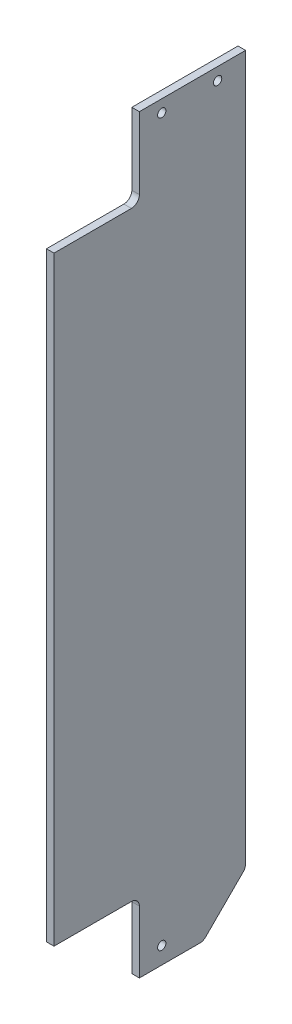
ISO-10303-21;
HEADER;
FILE_DESCRIPTION(('STEP AP214'),'2;1');
FILE_NAME('part.step','',(''),(''),'','','');
FILE_SCHEMA(('AUTOMOTIVE_DESIGN { 1 0 10303 214 1 1 1 1 }'));
ENDSEC;
DATA;
#1=APPLICATION_CONTEXT('core data for automotive mechanical design processes');
#2=APPLICATION_PROTOCOL_DEFINITION('international standard','automotive_design',2000,#1);
#3=PRODUCT_CONTEXT('',#1,'mechanical');
#4=PRODUCT('Part','Part','',(#3));
#5=PRODUCT_RELATED_PRODUCT_CATEGORY('part','',(#4));
#6=PRODUCT_DEFINITION_FORMATION('','',#4);
#7=PRODUCT_DEFINITION_CONTEXT('part definition',#1,'design');
#8=PRODUCT_DEFINITION('design','',#6,#7);
#9=PRODUCT_DEFINITION_SHAPE('','',#8);
#10=(LENGTH_UNIT() NAMED_UNIT(*) SI_UNIT(.MILLI.,.METRE.));
#11=(NAMED_UNIT(*) PLANE_ANGLE_UNIT() SI_UNIT($,.RADIAN.));
#12=(NAMED_UNIT(*) SI_UNIT($,.STERADIAN.) SOLID_ANGLE_UNIT());
#13=UNCERTAINTY_MEASURE_WITH_UNIT(LENGTH_MEASURE(1.E-05),#10,'distance_accuracy_value','');
#14=(GEOMETRIC_REPRESENTATION_CONTEXT(3) GLOBAL_UNCERTAINTY_ASSIGNED_CONTEXT((#13)) GLOBAL_UNIT_ASSIGNED_CONTEXT((#10,
#11,#12)) REPRESENTATION_CONTEXT('',''));
#15=CARTESIAN_POINT('',(0.,0.,0.));
#16=DIRECTION('',(0.,0.,1.));
#17=DIRECTION('',(1.,0.,0.));
#18=AXIS2_PLACEMENT_3D('',#15,#16,#17);
#19=CARTESIAN_POINT('',(3.,0.,0.));
#20=DIRECTION('',(-1.,0.,0.));
#21=DIRECTION('',(0.,0.,1.));
#22=AXIS2_PLACEMENT_3D('',#19,#20,#21);
#23=PLANE('',#22);
#24=DIRECTION('',(0.,0.707106781186547,-0.707106781186548));
#25=VECTOR('',#24,1.);
#26=CARTESIAN_POINT('',(3.,-249.8725,-60.3250000000001));
#27=LINE('',#26,#25);
#28=CARTESIAN_POINT('',(3.,-265.770064030267,-44.4274359697327));
#29=VERTEX_POINT('',#28);
#30=CARTESIAN_POINT('',(3.,-250.802435969733,-59.3950640302674));
#31=VERTEX_POINT('',#30);
#32=EDGE_CURVE('E245',#29,#31,#27,.T.);
#33=ORIENTED_EDGE('',*,*,#32,.T.);
#34=CARTESIAN_POINT('',(3.,-248.557371939465,-57.1500000000001));
#35=DIRECTION('',(-1.,0.,0.));
#36=DIRECTION('',(0.,0.,1.));
#37=AXIS2_PLACEMENT_3D('',#34,#35,#36);
#38=CIRCLE('',#37,3.175);
#39=CARTESIAN_POINT('',(3.,-248.557371939465,-60.3250000000001));
#40=VERTEX_POINT('',#39);
#41=EDGE_CURVE('E200',#31,#40,#38,.F.);
#42=ORIENTED_EDGE('',*,*,#41,.T.);
#43=DIRECTION('',(0.,1.,0.));
#44=VECTOR('',#43,1.);
#45=CARTESIAN_POINT('',(3.,31.75,-60.325));
#46=LINE('',#45,#44);
#47=CARTESIAN_POINT('',(3.,31.75,-60.325));
#48=VERTEX_POINT('',#47);
#49=EDGE_CURVE('E250',#40,#48,#46,.T.);
#50=ORIENTED_EDGE('',*,*,#49,.T.);
#51=DIRECTION('',(0.,0.,1.));
#52=VECTOR('',#51,1.);
#53=CARTESIAN_POINT('',(3.,31.75,-18.0975));
#54=LINE('',#53,#52);
#55=CARTESIAN_POINT('',(3.,31.75,-18.0975));
#56=VERTEX_POINT('',#55);
#57=EDGE_CURVE('E253',#48,#56,#54,.T.);
#58=ORIENTED_EDGE('',*,*,#57,.T.);
#59=DIRECTION('',(0.,-1.,0.));
#60=VECTOR('',#59,1.);
#61=CARTESIAN_POINT('',(3.,0.,-18.0975));
#62=LINE('',#61,#60);
#63=CARTESIAN_POINT('',(3.,3.175,-18.0975));
#64=VERTEX_POINT('',#63);
#65=EDGE_CURVE('E256',#56,#64,#62,.T.);
#66=ORIENTED_EDGE('',*,*,#65,.T.);
#67=CARTESIAN_POINT('',(3.,3.175,-14.9225));
#68=DIRECTION('',(-1.,0.,0.));
#69=DIRECTION('',(0.,0.,1.));
#70=AXIS2_PLACEMENT_3D('',#67,#68,#69);
#71=CIRCLE('',#70,3.175);
#72=CARTESIAN_POINT('',(3.,0.,-14.9225));
#73=VERTEX_POINT('',#72);
#74=EDGE_CURVE('E63',#64,#73,#71,.T.);
#75=ORIENTED_EDGE('',*,*,#74,.T.);
#76=DIRECTION('',(0.,0.,1.));
#77=VECTOR('',#76,1.);
#78=CARTESIAN_POINT('',(3.,0.,15.875));
#79=LINE('',#78,#77);
#80=CARTESIAN_POINT('',(3.,0.,15.875));
#81=VERTEX_POINT('',#80);
#82=EDGE_CURVE('E161',#73,#81,#79,.T.);
#83=ORIENTED_EDGE('',*,*,#82,.T.);
#84=DIRECTION('',(0.,-1.,0.));
#85=VECTOR('',#84,1.);
#86=CARTESIAN_POINT('',(3.,-238.76,15.875));
#87=LINE('',#86,#85);
#88=CARTESIAN_POINT('',(3.,-238.76,15.875));
#89=VERTEX_POINT('',#88);
#90=EDGE_CURVE('E156',#81,#89,#87,.T.);
#91=ORIENTED_EDGE('',*,*,#90,.T.);
#92=DIRECTION('',(0.,0.,-1.));
#93=VECTOR('',#92,1.);
#94=CARTESIAN_POINT('',(3.,-238.76,-18.0975));
#95=LINE('',#94,#93);
#96=CARTESIAN_POINT('',(3.,-238.76,-14.9225));
#97=VERTEX_POINT('',#96);
#98=EDGE_CURVE('E144',#89,#97,#95,.T.);
#99=ORIENTED_EDGE('',*,*,#98,.T.);
#100=CARTESIAN_POINT('',(3.,-241.935,-14.9225));
#101=DIRECTION('',(-1.,0.,0.));
#102=DIRECTION('',(0.,0.,1.));
#103=AXIS2_PLACEMENT_3D('',#100,#101,#102);
#104=CIRCLE('',#103,3.175);
#105=CARTESIAN_POINT('',(3.,-241.935,-18.0975));
#106=VERTEX_POINT('',#105);
#107=EDGE_CURVE('E11',#97,#106,#104,.T.);
#108=ORIENTED_EDGE('',*,*,#107,.T.);
#109=DIRECTION('',(0.,-1.,0.));
#110=VECTOR('',#109,1.);
#111=CARTESIAN_POINT('',(3.,-266.7,-18.0975));
#112=LINE('',#111,#110);
#113=CARTESIAN_POINT('',(3.,-266.7,-18.0975));
#114=VERTEX_POINT('',#113);
#115=EDGE_CURVE('E155',#106,#114,#112,.T.);
#116=ORIENTED_EDGE('',*,*,#115,.T.);
#117=DIRECTION('',(0.,0.,-1.));
#118=VECTOR('',#117,1.);
#119=CARTESIAN_POINT('',(3.,-266.7,-43.4975));
#120=LINE('',#119,#118);
#121=CARTESIAN_POINT('',(3.,-266.7,-42.1823719394654));
#122=VERTEX_POINT('',#121);
#123=EDGE_CURVE('E242',#114,#122,#120,.T.);
#124=ORIENTED_EDGE('',*,*,#123,.T.);
#125=CARTESIAN_POINT('',(3.,-263.525,-42.1823719394654));
#126=DIRECTION('',(-1.,0.,0.));
#127=DIRECTION('',(0.,0.,1.));
#128=AXIS2_PLACEMENT_3D('',#125,#126,#127);
#129=CIRCLE('',#128,3.175);
#130=EDGE_CURVE('E197',#122,#29,#129,.F.);
#131=ORIENTED_EDGE('',*,*,#130,.T.);
#132=EDGE_LOOP('',(#33,#42,#50,#58,#66,#75,#83,#91,#99,#108,#116,#124,#131));
#133=FACE_BOUND('',#132,.T.);
#134=CARTESIAN_POINT('',(3.,26.8732,-49.2125));
#135=DIRECTION('',(1.,0.,0.));
#136=DIRECTION('',(0.,0.,-1.));
#137=AXIS2_PLACEMENT_3D('',#134,#135,#136);
#138=CIRCLE('',#137,1.65);
#139=CARTESIAN_POINT('',(3.,26.8732,-50.8625));
#140=VERTEX_POINT('',#139);
#141=EDGE_CURVE('E263',#140,#140,#138,.T.);
#142=ORIENTED_EDGE('',*,*,#141,.F.);
#143=EDGE_LOOP('',(#142));
#144=FACE_BOUND('',#143,.T.);
#145=CARTESIAN_POINT('',(3.,26.8732,-26.9875));
#146=DIRECTION('',(1.,0.,0.));
#147=DIRECTION('',(0.,0.,-1.));
#148=AXIS2_PLACEMENT_3D('',#145,#146,#147);
#149=CIRCLE('',#148,1.65);
#150=CARTESIAN_POINT('',(3.,26.8732,-28.6375));
#151=VERTEX_POINT('',#150);
#152=EDGE_CURVE('E355',#151,#151,#149,.T.);
#153=ORIENTED_EDGE('',*,*,#152,.F.);
#154=EDGE_LOOP('',(#153));
#155=FACE_BOUND('',#154,.T.);
#156=CARTESIAN_POINT('',(3.,-259.9563,-26.9875));
#157=DIRECTION('',(1.,0.,0.));
#158=DIRECTION('',(0.,0.,1.));
#159=AXIS2_PLACEMENT_3D('',#156,#157,#158);
#160=CIRCLE('',#159,1.65000000000004);
#161=CARTESIAN_POINT('',(3.,-259.9563,-25.3375));
#162=VERTEX_POINT('',#161);
#163=EDGE_CURVE('E344',#162,#162,#160,.T.);
#164=ORIENTED_EDGE('',*,*,#163,.F.);
#165=EDGE_LOOP('',(#164));
#166=FACE_BOUND('',#165,.T.);
#167=ADVANCED_FACE('F47',(#133,#144,#155,#166),#23,.F.);
#168=CARTESIAN_POINT('',(0.,0.,0.));
#169=DIRECTION('',(-1.,0.,0.));
#170=DIRECTION('',(0.,0.,1.));
#171=AXIS2_PLACEMENT_3D('',#168,#169,#170);
#172=PLANE('',#171);
#173=CARTESIAN_POINT('',(0.,26.8732,-26.9875));
#174=DIRECTION('',(1.,0.,0.));
#175=DIRECTION('',(0.,0.,-1.));
#176=AXIS2_PLACEMENT_3D('',#173,#174,#175);
#177=CIRCLE('',#176,1.65);
#178=CARTESIAN_POINT('',(0.,26.8732,-28.6375));
#179=VERTEX_POINT('',#178);
#180=EDGE_CURVE('E352',#179,#179,#177,.T.);
#181=ORIENTED_EDGE('',*,*,#180,.T.);
#182=EDGE_LOOP('',(#181));
#183=FACE_BOUND('',#182,.T.);
#184=DIRECTION('',(0.,1.,0.));
#185=VECTOR('',#184,1.);
#186=CARTESIAN_POINT('',(0.,31.75,-60.325));
#187=LINE('',#186,#185);
#188=CARTESIAN_POINT('',(0.,-248.557371939465,-60.3250000000001));
#189=VERTEX_POINT('',#188);
#190=CARTESIAN_POINT('',(0.,31.75,-60.325));
#191=VERTEX_POINT('',#190);
#192=EDGE_CURVE('E275',#189,#191,#187,.T.);
#193=ORIENTED_EDGE('',*,*,#192,.F.);
#194=CARTESIAN_POINT('',(0.,-248.557371939465,-57.1500000000001));
#195=DIRECTION('',(-1.,0.,0.));
#196=DIRECTION('',(0.,0.,1.));
#197=AXIS2_PLACEMENT_3D('',#194,#195,#196);
#198=CIRCLE('',#197,3.175);
#199=CARTESIAN_POINT('',(0.,-250.802435969733,-59.3950640302674));
#200=VERTEX_POINT('',#199);
#201=EDGE_CURVE('E187',#189,#200,#198,.T.);
#202=ORIENTED_EDGE('',*,*,#201,.T.);
#203=DIRECTION('',(0.,0.707106781186547,-0.707106781186548));
#204=VECTOR('',#203,1.);
#205=CARTESIAN_POINT('',(0.,-249.8725,-60.3250000000001));
#206=LINE('',#205,#204);
#207=CARTESIAN_POINT('',(0.,-265.770064030267,-44.4274359697327));
#208=VERTEX_POINT('',#207);
#209=EDGE_CURVE('E271',#208,#200,#206,.T.);
#210=ORIENTED_EDGE('',*,*,#209,.F.);
#211=CARTESIAN_POINT('',(0.,-263.525,-42.1823719394654));
#212=DIRECTION('',(-1.,0.,0.));
#213=DIRECTION('',(0.,0.,1.));
#214=AXIS2_PLACEMENT_3D('',#211,#212,#213);
#215=CIRCLE('',#214,3.175);
#216=CARTESIAN_POINT('',(0.,-266.7,-42.1823719394654));
#217=VERTEX_POINT('',#216);
#218=EDGE_CURVE('E178',#208,#217,#215,.T.);
#219=ORIENTED_EDGE('',*,*,#218,.T.);
#220=DIRECTION('',(0.,0.,-1.));
#221=VECTOR('',#220,1.);
#222=CARTESIAN_POINT('',(0.,-266.7,-43.4975));
#223=LINE('',#222,#221);
#224=CARTESIAN_POINT('',(0.,-266.7,-18.0975));
#225=VERTEX_POINT('',#224);
#226=EDGE_CURVE('E267',#225,#217,#223,.T.);
#227=ORIENTED_EDGE('',*,*,#226,.F.);
#228=DIRECTION('',(0.,-1.,0.));
#229=VECTOR('',#228,1.);
#230=CARTESIAN_POINT('',(0.,-266.7,-18.0975));
#231=LINE('',#230,#229);
#232=CARTESIAN_POINT('',(0.,-241.935,-18.0975));
#233=VERTEX_POINT('',#232);
#234=EDGE_CURVE('E230',#233,#225,#231,.T.);
#235=ORIENTED_EDGE('',*,*,#234,.F.);
#236=CARTESIAN_POINT('',(0.,-241.935,-14.9225));
#237=DIRECTION('',(-1.,0.,0.));
#238=DIRECTION('',(0.,0.,1.));
#239=AXIS2_PLACEMENT_3D('',#236,#237,#238);
#240=CIRCLE('',#239,3.175);
#241=CARTESIAN_POINT('',(0.,-238.76,-14.9225));
#242=VERTEX_POINT('',#241);
#243=EDGE_CURVE('E56',#233,#242,#240,.F.);
#244=ORIENTED_EDGE('',*,*,#243,.T.);
#245=DIRECTION('',(0.,0.,-1.));
#246=VECTOR('',#245,1.);
#247=CARTESIAN_POINT('',(0.,-238.76,-18.0975));
#248=LINE('',#247,#246);
#249=CARTESIAN_POINT('',(0.,-238.76,15.875));
#250=VERTEX_POINT('',#249);
#251=EDGE_CURVE('E228',#250,#242,#248,.T.);
#252=ORIENTED_EDGE('',*,*,#251,.F.);
#253=DIRECTION('',(0.,-1.,0.));
#254=VECTOR('',#253,1.);
#255=CARTESIAN_POINT('',(0.,-238.76,15.875));
#256=LINE('',#255,#254);
#257=CARTESIAN_POINT('',(0.,0.,15.875));
#258=VERTEX_POINT('',#257);
#259=EDGE_CURVE('E170',#258,#250,#256,.T.);
#260=ORIENTED_EDGE('',*,*,#259,.F.);
#261=DIRECTION('',(0.,0.,1.));
#262=VECTOR('',#261,1.);
#263=CARTESIAN_POINT('',(0.,0.,15.875));
#264=LINE('',#263,#262);
#265=CARTESIAN_POINT('',(0.,0.,-14.9225));
#266=VERTEX_POINT('',#265);
#267=EDGE_CURVE('E166',#266,#258,#264,.T.);
#268=ORIENTED_EDGE('',*,*,#267,.F.);
#269=CARTESIAN_POINT('',(0.,3.175,-14.9225));
#270=DIRECTION('',(-1.,0.,0.));
#271=DIRECTION('',(0.,0.,1.));
#272=AXIS2_PLACEMENT_3D('',#269,#270,#271);
#273=CIRCLE('',#272,3.175);
#274=CARTESIAN_POINT('',(0.,3.175,-18.0975));
#275=VERTEX_POINT('',#274);
#276=EDGE_CURVE('E218',#266,#275,#273,.F.);
#277=ORIENTED_EDGE('',*,*,#276,.T.);
#278=DIRECTION('',(0.,-1.,0.));
#279=VECTOR('',#278,1.);
#280=CARTESIAN_POINT('',(0.,0.,-18.0975));
#281=LINE('',#280,#279);
#282=CARTESIAN_POINT('',(0.,31.75,-18.0975));
#283=VERTEX_POINT('',#282);
#284=EDGE_CURVE('E281',#283,#275,#281,.T.);
#285=ORIENTED_EDGE('',*,*,#284,.F.);
#286=DIRECTION('',(0.,0.,1.));
#287=VECTOR('',#286,1.);
#288=CARTESIAN_POINT('',(0.,31.75,-18.0975));
#289=LINE('',#288,#287);
#290=EDGE_CURVE('E278',#191,#283,#289,.T.);
#291=ORIENTED_EDGE('',*,*,#290,.F.);
#292=EDGE_LOOP('',(#193,#202,#210,#219,#227,#235,#244,#252,#260,#268,#277,#285,#291));
#293=FACE_BOUND('',#292,.T.);
#294=CARTESIAN_POINT('',(0.,26.8732,-49.2125));
#295=DIRECTION('',(1.,0.,0.));
#296=DIRECTION('',(0.,0.,-1.));
#297=AXIS2_PLACEMENT_3D('',#294,#295,#296);
#298=CIRCLE('',#297,1.65);
#299=CARTESIAN_POINT('',(0.,26.8732,-50.8625));
#300=VERTEX_POINT('',#299);
#301=EDGE_CURVE('E359',#300,#300,#298,.T.);
#302=ORIENTED_EDGE('',*,*,#301,.T.);
#303=EDGE_LOOP('',(#302));
#304=FACE_BOUND('',#303,.T.);
#305=CARTESIAN_POINT('',(0.,-259.9563,-26.9875));
#306=DIRECTION('',(1.,0.,0.));
#307=DIRECTION('',(0.,0.,1.));
#308=AXIS2_PLACEMENT_3D('',#305,#306,#307);
#309=CIRCLE('',#308,1.65000000000004);
#310=CARTESIAN_POINT('',(0.,-259.9563,-25.3375));
#311=VERTEX_POINT('',#310);
#312=EDGE_CURVE('E347',#311,#311,#309,.T.);
#313=ORIENTED_EDGE('',*,*,#312,.T.);
#314=EDGE_LOOP('',(#313));
#315=FACE_BOUND('',#314,.T.);
#316=ADVANCED_FACE('F226',(#183,#293,#304,#315),#172,.T.);
#317=CARTESIAN_POINT('',(3.,-238.76,15.875));
#318=DIRECTION('',(0.,0.,-1.));
#319=DIRECTION('',(0.,1.,0.));
#320=AXIS2_PLACEMENT_3D('',#317,#318,#319);
#321=PLANE('',#320);
#322=ORIENTED_EDGE('',*,*,#259,.T.);
#323=DIRECTION('',(-1.,0.,0.));
#324=VECTOR('',#323,1.);
#325=CARTESIAN_POINT('',(3.,-238.76,15.875));
#326=LINE('',#325,#324);
#327=EDGE_CURVE('E149',#89,#250,#326,.T.);
#328=ORIENTED_EDGE('',*,*,#327,.F.);
#329=ORIENTED_EDGE('',*,*,#90,.F.);
#330=DIRECTION('',(-1.,0.,0.));
#331=VECTOR('',#330,1.);
#332=CARTESIAN_POINT('',(3.,0.,15.875));
#333=LINE('',#332,#331);
#334=EDGE_CURVE('E261',#81,#258,#333,.T.);
#335=ORIENTED_EDGE('',*,*,#334,.T.);
#336=EDGE_LOOP('',(#322,#328,#329,#335));
#337=FACE_BOUND('',#336,.T.);
#338=ADVANCED_FACE('F168',(#337),#321,.F.);
#339=CARTESIAN_POINT('',(3.,-238.76,-18.0975));
#340=DIRECTION('',(0.,1.,0.));
#341=DIRECTION('',(0.,0.,1.));
#342=AXIS2_PLACEMENT_3D('',#339,#340,#341);
#343=PLANE('',#342);
#344=ORIENTED_EDGE('',*,*,#251,.T.);
#345=DIRECTION('',(-1.,0.,0.));
#346=VECTOR('',#345,1.);
#347=CARTESIAN_POINT('',(3.,-238.76,-14.9225));
#348=LINE('',#347,#346);
#349=EDGE_CURVE('E152',#242,#97,#348,.F.);
#350=ORIENTED_EDGE('',*,*,#349,.T.);
#351=ORIENTED_EDGE('',*,*,#98,.F.);
#352=ORIENTED_EDGE('',*,*,#327,.T.);
#353=EDGE_LOOP('',(#344,#350,#351,#352));
#354=FACE_BOUND('',#353,.T.);
#355=ADVANCED_FACE('F147',(#354),#343,.F.);
#356=CARTESIAN_POINT('',(3.,-266.7,-18.0975));
#357=DIRECTION('',(0.,0.,-1.));
#358=DIRECTION('',(-1.,0.,0.));
#359=AXIS2_PLACEMENT_3D('',#356,#357,#358);
#360=PLANE('',#359);
#361=ORIENTED_EDGE('',*,*,#115,.F.);
#362=DIRECTION('',(-1.,0.,0.));
#363=VECTOR('',#362,1.);
#364=CARTESIAN_POINT('',(0.,-241.935,-18.0975));
#365=LINE('',#364,#363);
#366=EDGE_CURVE('E212',#106,#233,#365,.T.);
#367=ORIENTED_EDGE('',*,*,#366,.T.);
#368=ORIENTED_EDGE('',*,*,#234,.T.);
#369=DIRECTION('',(-1.,0.,0.));
#370=VECTOR('',#369,1.);
#371=CARTESIAN_POINT('',(3.,-266.7,-18.0975));
#372=LINE('',#371,#370);
#373=EDGE_CURVE('E173',#114,#225,#372,.T.);
#374=ORIENTED_EDGE('',*,*,#373,.F.);
#375=EDGE_LOOP('',(#361,#367,#368,#374));
#376=FACE_BOUND('',#375,.T.);
#377=ADVANCED_FACE('F239',(#376),#360,.F.);
#378=CARTESIAN_POINT('',(3.,-266.7,-43.4975));
#379=DIRECTION('',(0.,1.,0.));
#380=DIRECTION('',(0.,0.,1.));
#381=AXIS2_PLACEMENT_3D('',#378,#379,#380);
#382=PLANE('',#381);
#383=ORIENTED_EDGE('',*,*,#226,.T.);
#384=DIRECTION('',(-1.,0.,0.));
#385=VECTOR('',#384,1.);
#386=CARTESIAN_POINT('',(3.,-266.7,-42.1823719394654));
#387=LINE('',#386,#385);
#388=EDGE_CURVE('E203',#217,#122,#387,.F.);
#389=ORIENTED_EDGE('',*,*,#388,.T.);
#390=ORIENTED_EDGE('',*,*,#123,.F.);
#391=ORIENTED_EDGE('',*,*,#373,.T.);
#392=EDGE_LOOP('',(#383,#389,#390,#391));
#393=FACE_BOUND('',#392,.T.);
#394=ADVANCED_FACE('F459',(#393),#382,.F.);
#395=CARTESIAN_POINT('',(3.,-249.8725,-60.3250000000001));
#396=DIRECTION('',(0.,0.707106781186548,0.707106781186547));
#397=DIRECTION('',(0.,-0.707106781186547,0.707106781186548));
#398=AXIS2_PLACEMENT_3D('',#395,#396,#397);
#399=PLANE('',#398);
#400=ORIENTED_EDGE('',*,*,#209,.T.);
#401=DIRECTION('',(-1.,0.,0.));
#402=VECTOR('',#401,1.);
#403=CARTESIAN_POINT('',(3.,-250.802435969733,-59.3950640302674));
#404=LINE('',#403,#402);
#405=EDGE_CURVE('E194',#200,#31,#404,.F.);
#406=ORIENTED_EDGE('',*,*,#405,.T.);
#407=ORIENTED_EDGE('',*,*,#32,.F.);
#408=DIRECTION('',(-1.,0.,0.));
#409=VECTOR('',#408,1.);
#410=CARTESIAN_POINT('',(3.,-265.770064030267,-44.4274359697327));
#411=LINE('',#410,#409);
#412=EDGE_CURVE('E190',#29,#208,#411,.T.);
#413=ORIENTED_EDGE('',*,*,#412,.T.);
#414=EDGE_LOOP('',(#400,#406,#407,#413));
#415=FACE_BOUND('',#414,.T.);
#416=ADVANCED_FACE('F450',(#415),#399,.F.);
#417=CARTESIAN_POINT('',(3.,31.75,-60.325));
#418=DIRECTION('',(0.,0.,1.));
#419=DIRECTION('',(0.,-1.,0.));
#420=AXIS2_PLACEMENT_3D('',#417,#418,#419);
#421=PLANE('',#420);
#422=ORIENTED_EDGE('',*,*,#49,.F.);
#423=DIRECTION('',(-1.,0.,0.));
#424=VECTOR('',#423,1.);
#425=CARTESIAN_POINT('',(3.,-248.557371939465,-60.3250000000001));
#426=LINE('',#425,#424);
#427=EDGE_CURVE('E172',#40,#189,#426,.T.);
#428=ORIENTED_EDGE('',*,*,#427,.T.);
#429=ORIENTED_EDGE('',*,*,#192,.T.);
#430=DIRECTION('',(-1.,0.,0.));
#431=VECTOR('',#430,1.);
#432=CARTESIAN_POINT('',(3.,31.75,-60.325));
#433=LINE('',#432,#431);
#434=EDGE_CURVE('E181',#48,#191,#433,.T.);
#435=ORIENTED_EDGE('',*,*,#434,.F.);
#436=EDGE_LOOP('',(#422,#428,#429,#435));
#437=FACE_BOUND('',#436,.T.);
#438=ADVANCED_FACE('F441',(#437),#421,.F.);
#439=CARTESIAN_POINT('',(3.,31.75,-18.0975));
#440=DIRECTION('',(0.,-1.,0.));
#441=DIRECTION('',(0.,0.,-1.));
#442=AXIS2_PLACEMENT_3D('',#439,#440,#441);
#443=PLANE('',#442);
#444=ORIENTED_EDGE('',*,*,#290,.T.);
#445=DIRECTION('',(-1.,0.,0.));
#446=VECTOR('',#445,1.);
#447=CARTESIAN_POINT('',(3.,31.75,-18.0975));
#448=LINE('',#447,#446);
#449=EDGE_CURVE('E288',#56,#283,#448,.T.);
#450=ORIENTED_EDGE('',*,*,#449,.F.);
#451=ORIENTED_EDGE('',*,*,#57,.F.);
#452=ORIENTED_EDGE('',*,*,#434,.T.);
#453=EDGE_LOOP('',(#444,#450,#451,#452));
#454=FACE_BOUND('',#453,.T.);
#455=ADVANCED_FACE('F297',(#454),#443,.F.);
#456=CARTESIAN_POINT('',(3.,0.,-18.0975));
#457=DIRECTION('',(0.,0.,-1.));
#458=DIRECTION('',(-1.,0.,0.));
#459=AXIS2_PLACEMENT_3D('',#456,#457,#458);
#460=PLANE('',#459);
#461=ORIENTED_EDGE('',*,*,#284,.T.);
#462=DIRECTION('',(-1.,0.,0.));
#463=VECTOR('',#462,1.);
#464=CARTESIAN_POINT('',(3.,3.175,-18.0975));
#465=LINE('',#464,#463);
#466=EDGE_CURVE('E71',#275,#64,#465,.F.);
#467=ORIENTED_EDGE('',*,*,#466,.T.);
#468=ORIENTED_EDGE('',*,*,#65,.F.);
#469=ORIENTED_EDGE('',*,*,#449,.T.);
#470=EDGE_LOOP('',(#461,#467,#468,#469));
#471=FACE_BOUND('',#470,.T.);
#472=ADVANCED_FACE('F303',(#471),#460,.F.);
#473=CARTESIAN_POINT('',(3.,0.,15.875));
#474=DIRECTION('',(0.,-1.,0.));
#475=DIRECTION('',(0.,0.,-1.));
#476=AXIS2_PLACEMENT_3D('',#473,#474,#475);
#477=PLANE('',#476);
#478=ORIENTED_EDGE('',*,*,#82,.F.);
#479=DIRECTION('',(-1.,0.,0.));
#480=VECTOR('',#479,1.);
#481=CARTESIAN_POINT('',(0.,0.,-14.9225));
#482=LINE('',#481,#480);
#483=EDGE_CURVE('E206',#73,#266,#482,.T.);
#484=ORIENTED_EDGE('',*,*,#483,.T.);
#485=ORIENTED_EDGE('',*,*,#267,.T.);
#486=ORIENTED_EDGE('',*,*,#334,.F.);
#487=EDGE_LOOP('',(#478,#484,#485,#486));
#488=FACE_BOUND('',#487,.T.);
#489=ADVANCED_FACE('F308',(#488),#477,.F.);
#490=CARTESIAN_POINT('',(3.,26.8732,-49.2125));
#491=DIRECTION('',(-1.,0.,0.));
#492=DIRECTION('',(0.,0.,1.));
#493=AXIS2_PLACEMENT_3D('',#490,#491,#492);
#494=CYLINDRICAL_SURFACE('',#493,1.65);
#495=ORIENTED_EDGE('',*,*,#141,.T.);
#496=EDGE_LOOP('',(#495));
#497=FACE_BOUND('',#496,.T.);
#498=ORIENTED_EDGE('',*,*,#301,.F.);
#499=EDGE_LOOP('',(#498));
#500=FACE_BOUND('',#499,.T.);
#501=ADVANCED_FACE('F310',(#497,#500),#494,.F.);
#502=CARTESIAN_POINT('',(3.,26.8732,-26.9875));
#503=DIRECTION('',(-1.,0.,0.));
#504=DIRECTION('',(0.,0.,1.));
#505=AXIS2_PLACEMENT_3D('',#502,#503,#504);
#506=CYLINDRICAL_SURFACE('',#505,1.65);
#507=ORIENTED_EDGE('',*,*,#152,.T.);
#508=EDGE_LOOP('',(#507));
#509=FACE_BOUND('',#508,.T.);
#510=ORIENTED_EDGE('',*,*,#180,.F.);
#511=EDGE_LOOP('',(#510));
#512=FACE_BOUND('',#511,.T.);
#513=ADVANCED_FACE('F316',(#509,#512),#506,.F.);
#514=CARTESIAN_POINT('',(3.,-259.9563,-26.9875));
#515=DIRECTION('',(-1.,0.,0.));
#516=DIRECTION('',(0.,0.,1.));
#517=AXIS2_PLACEMENT_3D('',#514,#515,#516);
#518=CYLINDRICAL_SURFACE('',#517,1.65000000000004);
#519=ORIENTED_EDGE('',*,*,#163,.T.);
#520=EDGE_LOOP('',(#519));
#521=FACE_BOUND('',#520,.T.);
#522=ORIENTED_EDGE('',*,*,#312,.F.);
#523=EDGE_LOOP('',(#522));
#524=FACE_BOUND('',#523,.T.);
#525=ADVANCED_FACE('F330',(#521,#524),#518,.F.);
#526=CARTESIAN_POINT('',(3.,-248.557371939465,-57.1500000000001));
#527=DIRECTION('',(-1.,0.,0.));
#528=DIRECTION('',(0.,0.,1.));
#529=AXIS2_PLACEMENT_3D('',#526,#527,#528);
#530=CYLINDRICAL_SURFACE('',#529,3.175);
#531=ORIENTED_EDGE('',*,*,#41,.F.);
#532=ORIENTED_EDGE('',*,*,#405,.F.);
#533=ORIENTED_EDGE('',*,*,#201,.F.);
#534=ORIENTED_EDGE('',*,*,#427,.F.);
#535=EDGE_LOOP('',(#531,#532,#533,#534));
#536=FACE_BOUND('',#535,.T.);
#537=ADVANCED_FACE('F333',(#536),#530,.T.);
#538=CARTESIAN_POINT('',(3.,-263.525,-42.1823719394654));
#539=DIRECTION('',(-1.,0.,0.));
#540=DIRECTION('',(0.,0.,1.));
#541=AXIS2_PLACEMENT_3D('',#538,#539,#540);
#542=CYLINDRICAL_SURFACE('',#541,3.175);
#543=ORIENTED_EDGE('',*,*,#130,.F.);
#544=ORIENTED_EDGE('',*,*,#388,.F.);
#545=ORIENTED_EDGE('',*,*,#218,.F.);
#546=ORIENTED_EDGE('',*,*,#412,.F.);
#547=EDGE_LOOP('',(#543,#544,#545,#546));
#548=FACE_BOUND('',#547,.T.);
#549=ADVANCED_FACE('F338',(#548),#542,.T.);
#550=CARTESIAN_POINT('',(3.,3.175,-14.9225));
#551=DIRECTION('',(1.,0.,0.));
#552=DIRECTION('',(0.,0.,-1.));
#553=AXIS2_PLACEMENT_3D('',#550,#551,#552);
#554=CYLINDRICAL_SURFACE('',#553,3.175);
#555=ORIENTED_EDGE('',*,*,#74,.F.);
#556=ORIENTED_EDGE('',*,*,#466,.F.);
#557=ORIENTED_EDGE('',*,*,#276,.F.);
#558=ORIENTED_EDGE('',*,*,#483,.F.);
#559=EDGE_LOOP('',(#555,#556,#557,#558));
#560=FACE_BOUND('',#559,.T.);
#561=ADVANCED_FACE('F305',(#560),#554,.F.);
#562=CARTESIAN_POINT('',(3.,-241.935,-14.9225));
#563=DIRECTION('',(1.,0.,0.));
#564=DIRECTION('',(0.,0.,-1.));
#565=AXIS2_PLACEMENT_3D('',#562,#563,#564);
#566=CYLINDRICAL_SURFACE('',#565,3.175);
#567=ORIENTED_EDGE('',*,*,#107,.F.);
#568=ORIENTED_EDGE('',*,*,#349,.F.);
#569=ORIENTED_EDGE('',*,*,#243,.F.);
#570=ORIENTED_EDGE('',*,*,#366,.F.);
#571=EDGE_LOOP('',(#567,#568,#569,#570));
#572=FACE_BOUND('',#571,.T.);
#573=ADVANCED_FACE('F49',(#572),#566,.F.);
#574=CLOSED_SHELL('',(#167,#316,#338,#355,#377,#394,#416,#438,#455,#472,#489,#501,#513,#525,
#537,#549,#561,#573));
#575=MANIFOLD_SOLID_BREP('B2',#574);
#576=ADVANCED_BREP_SHAPE_REPRESENTATION('',(#18,#575),#14);
#577=SHAPE_DEFINITION_REPRESENTATION(#9,#576);
ENDSEC;
END-ISO-10303-21;
